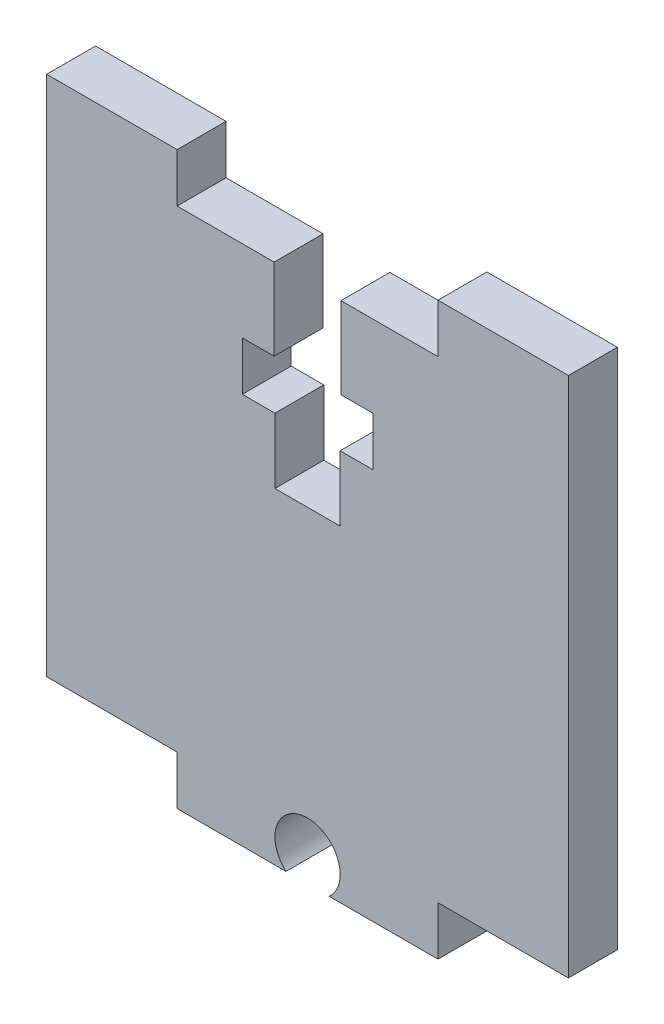
ISO-10303-21;
HEADER;
FILE_DESCRIPTION(('STEP AP214'),'2;1');
FILE_NAME('part.step','',(''),(''),'','','');
FILE_SCHEMA(('AUTOMOTIVE_DESIGN { 1 0 10303 214 1 1 1 1 }'));
ENDSEC;
DATA;
#1=APPLICATION_CONTEXT('core data for automotive mechanical design processes');
#2=APPLICATION_PROTOCOL_DEFINITION('international standard','automotive_design',2000,#1);
#3=PRODUCT_CONTEXT('',#1,'mechanical');
#4=PRODUCT('Part','Part','',(#3));
#5=PRODUCT_RELATED_PRODUCT_CATEGORY('part','',(#4));
#6=PRODUCT_DEFINITION_FORMATION('','',#4);
#7=PRODUCT_DEFINITION_CONTEXT('part definition',#1,'design');
#8=PRODUCT_DEFINITION('design','',#6,#7);
#9=PRODUCT_DEFINITION_SHAPE('','',#8);
#10=(LENGTH_UNIT() NAMED_UNIT(*) SI_UNIT(.MILLI.,.METRE.));
#11=(NAMED_UNIT(*) PLANE_ANGLE_UNIT() SI_UNIT($,.RADIAN.));
#12=(NAMED_UNIT(*) SI_UNIT($,.STERADIAN.) SOLID_ANGLE_UNIT());
#13=UNCERTAINTY_MEASURE_WITH_UNIT(LENGTH_MEASURE(1.E-05),#10,'distance_accuracy_value','');
#14=(GEOMETRIC_REPRESENTATION_CONTEXT(3) GLOBAL_UNCERTAINTY_ASSIGNED_CONTEXT((#13)) GLOBAL_UNIT_ASSIGNED_CONTEXT((#10,
#11,#12)) REPRESENTATION_CONTEXT('',''));
#15=CARTESIAN_POINT('',(0.,0.,0.));
#16=DIRECTION('',(0.,0.,1.));
#17=DIRECTION('',(1.,0.,0.));
#18=AXIS2_PLACEMENT_3D('',#15,#16,#17);
#19=CARTESIAN_POINT('',(0.,18.3553054771042,3.));
#20=DIRECTION('',(0.,0.,-1.));
#21=DIRECTION('',(-1.,0.,0.));
#22=AXIS2_PLACEMENT_3D('',#19,#20,#21);
#23=CYLINDRICAL_SURFACE('',#22,2.);
#24=CARTESIAN_POINT('',(0.,18.3553054771042,0.));
#25=DIRECTION('',(0.,0.,-1.));
#26=DIRECTION('',(1.,0.,0.));
#27=AXIS2_PLACEMENT_3D('',#24,#25,#26);
#28=CIRCLE('',#27,2.);
#29=CARTESIAN_POINT('',(-1.3228756555323,16.8553054771042,0.));
#30=VERTEX_POINT('',#29);
#31=CARTESIAN_POINT('',(1.3228756555323,16.8553054771042,0.));
#32=VERTEX_POINT('',#31);
#33=EDGE_CURVE('E237',#30,#32,#28,.T.);
#34=ORIENTED_EDGE('',*,*,#33,.T.);
#35=DIRECTION('',(0.,0.,-1.));
#36=VECTOR('',#35,1.);
#37=CARTESIAN_POINT('',(1.3228756555323,16.8553054771042,3.));
#38=LINE('',#37,#36);
#39=CARTESIAN_POINT('',(1.3228756555323,16.8553054771042,3.));
#40=VERTEX_POINT('',#39);
#41=EDGE_CURVE('E11',#40,#32,#38,.T.);
#42=ORIENTED_EDGE('',*,*,#41,.F.);
#43=CARTESIAN_POINT('',(0.,18.3553054771042,3.));
#44=DIRECTION('',(0.,0.,-1.));
#45=DIRECTION('',(1.,0.,0.));
#46=AXIS2_PLACEMENT_3D('',#43,#44,#45);
#47=CIRCLE('',#46,2.);
#48=CARTESIAN_POINT('',(-1.3228756555323,16.8553054771042,3.));
#49=VERTEX_POINT('',#48);
#50=EDGE_CURVE('E287',#49,#40,#47,.T.);
#51=ORIENTED_EDGE('',*,*,#50,.F.);
#52=DIRECTION('',(0.,0.,-1.));
#53=VECTOR('',#52,1.);
#54=CARTESIAN_POINT('',(-1.3228756555323,16.8553054771042,3.));
#55=LINE('',#54,#53);
#56=EDGE_CURVE('E233',#49,#30,#55,.T.);
#57=ORIENTED_EDGE('',*,*,#56,.T.);
#58=EDGE_LOOP('',(#34,#42,#51,#57));
#59=FACE_BOUND('',#58,.T.);
#60=ADVANCED_FACE('F33',(#59),#23,.F.);
#61=CARTESIAN_POINT('',(1.3228756555323,16.8553054771042,3.));
#62=DIRECTION('',(0.,1.,0.));
#63=DIRECTION('',(0.,0.,1.));
#64=AXIS2_PLACEMENT_3D('',#61,#62,#63);
#65=PLANE('',#64);
#66=DIRECTION('',(1.,0.,0.));
#67=VECTOR('',#66,1.);
#68=CARTESIAN_POINT('',(1.3228756555323,16.8553054771042,0.));
#69=LINE('',#68,#67);
#70=CARTESIAN_POINT('',(8.00000000000001,16.8553054771042,0.));
#71=VERTEX_POINT('',#70);
#72=EDGE_CURVE('E240',#32,#71,#69,.T.);
#73=ORIENTED_EDGE('',*,*,#72,.T.);
#74=DIRECTION('',(0.,0.,-1.));
#75=VECTOR('',#74,1.);
#76=CARTESIAN_POINT('',(8.00000000000001,16.8553054771042,3.));
#77=LINE('',#76,#75);
#78=CARTESIAN_POINT('',(8.00000000000001,16.8553054771042,3.));
#79=VERTEX_POINT('',#78);
#80=EDGE_CURVE('E41',#79,#71,#77,.T.);
#81=ORIENTED_EDGE('',*,*,#80,.F.);
#82=DIRECTION('',(1.,0.,0.));
#83=VECTOR('',#82,1.);
#84=CARTESIAN_POINT('',(1.3228756555323,16.8553054771042,3.));
#85=LINE('',#84,#83);
#86=EDGE_CURVE('E146',#40,#79,#85,.T.);
#87=ORIENTED_EDGE('',*,*,#86,.F.);
#88=ORIENTED_EDGE('',*,*,#41,.T.);
#89=EDGE_LOOP('',(#73,#81,#87,#88));
#90=FACE_BOUND('',#89,.T.);
#91=ADVANCED_FACE('F435',(#90),#65,.F.);
#92=CARTESIAN_POINT('',(8.00000000000001,16.8553054771042,3.));
#93=DIRECTION('',(-1.,0.,0.));
#94=DIRECTION('',(0.,0.,1.));
#95=AXIS2_PLACEMENT_3D('',#92,#93,#94);
#96=PLANE('',#95);
#97=DIRECTION('',(0.,1.,0.));
#98=VECTOR('',#97,1.);
#99=CARTESIAN_POINT('',(8.00000000000001,16.8553054771042,0.));
#100=LINE('',#99,#98);
#101=CARTESIAN_POINT('',(8.00000000000001,19.8553054771042,0.));
#102=VERTEX_POINT('',#101);
#103=EDGE_CURVE('E242',#71,#102,#100,.T.);
#104=ORIENTED_EDGE('',*,*,#103,.T.);
#105=DIRECTION('',(0.,0.,-1.));
#106=VECTOR('',#105,1.);
#107=CARTESIAN_POINT('',(8.00000000000001,19.8553054771042,3.));
#108=LINE('',#107,#106);
#109=CARTESIAN_POINT('',(8.00000000000001,19.8553054771042,3.));
#110=VERTEX_POINT('',#109);
#111=EDGE_CURVE('E348',#110,#102,#108,.T.);
#112=ORIENTED_EDGE('',*,*,#111,.F.);
#113=DIRECTION('',(0.,1.,0.));
#114=VECTOR('',#113,1.);
#115=CARTESIAN_POINT('',(8.00000000000001,16.8553054771042,3.));
#116=LINE('',#115,#114);
#117=EDGE_CURVE('E356',#79,#110,#116,.T.);
#118=ORIENTED_EDGE('',*,*,#117,.F.);
#119=ORIENTED_EDGE('',*,*,#80,.T.);
#120=EDGE_LOOP('',(#104,#112,#118,#119));
#121=FACE_BOUND('',#120,.T.);
#122=ADVANCED_FACE('F354',(#121),#96,.F.);
#123=CARTESIAN_POINT('',(16.,19.8553054771042,3.));
#124=DIRECTION('',(0.,1.,0.));
#125=DIRECTION('',(0.,0.,1.));
#126=AXIS2_PLACEMENT_3D('',#123,#124,#125);
#127=PLANE('',#126);
#128=DIRECTION('',(1.,0.,0.));
#129=VECTOR('',#128,1.);
#130=CARTESIAN_POINT('',(16.,19.8553054771042,0.));
#131=LINE('',#130,#129);
#132=CARTESIAN_POINT('',(16.,19.8553054771042,0.));
#133=VERTEX_POINT('',#132);
#134=EDGE_CURVE('E244',#102,#133,#131,.T.);
#135=ORIENTED_EDGE('',*,*,#134,.T.);
#136=DIRECTION('',(0.,0.,-1.));
#137=VECTOR('',#136,1.);
#138=CARTESIAN_POINT('',(16.,19.8553054771042,3.));
#139=LINE('',#138,#137);
#140=CARTESIAN_POINT('',(16.,19.8553054771042,3.));
#141=VERTEX_POINT('',#140);
#142=EDGE_CURVE('E345',#141,#133,#139,.T.);
#143=ORIENTED_EDGE('',*,*,#142,.F.);
#144=DIRECTION('',(1.,0.,0.));
#145=VECTOR('',#144,1.);
#146=CARTESIAN_POINT('',(16.,19.8553054771042,3.));
#147=LINE('',#146,#145);
#148=EDGE_CURVE('E374',#110,#141,#147,.T.);
#149=ORIENTED_EDGE('',*,*,#148,.F.);
#150=ORIENTED_EDGE('',*,*,#111,.T.);
#151=EDGE_LOOP('',(#135,#143,#149,#150));
#152=FACE_BOUND('',#151,.T.);
#153=ADVANCED_FACE('F365',(#152),#127,.F.);
#154=CARTESIAN_POINT('',(16.,51.8553054771042,3.));
#155=DIRECTION('',(-1.,0.,0.));
#156=DIRECTION('',(0.,0.,1.));
#157=AXIS2_PLACEMENT_3D('',#154,#155,#156);
#158=PLANE('',#157);
#159=DIRECTION('',(0.,1.,0.));
#160=VECTOR('',#159,1.);
#161=CARTESIAN_POINT('',(16.,51.8553054771042,0.));
#162=LINE('',#161,#160);
#163=CARTESIAN_POINT('',(16.,51.8553054771042,0.));
#164=VERTEX_POINT('',#163);
#165=EDGE_CURVE('E246',#133,#164,#162,.T.);
#166=ORIENTED_EDGE('',*,*,#165,.T.);
#167=DIRECTION('',(0.,0.,-1.));
#168=VECTOR('',#167,1.);
#169=CARTESIAN_POINT('',(16.,51.8553054771042,3.));
#170=LINE('',#169,#168);
#171=CARTESIAN_POINT('',(16.,51.8553054771042,3.));
#172=VERTEX_POINT('',#171);
#173=EDGE_CURVE('E342',#172,#164,#170,.T.);
#174=ORIENTED_EDGE('',*,*,#173,.F.);
#175=DIRECTION('',(0.,1.,0.));
#176=VECTOR('',#175,1.);
#177=CARTESIAN_POINT('',(16.,51.8553054771042,3.));
#178=LINE('',#177,#176);
#179=EDGE_CURVE('E371',#141,#172,#178,.T.);
#180=ORIENTED_EDGE('',*,*,#179,.F.);
#181=ORIENTED_EDGE('',*,*,#142,.T.);
#182=EDGE_LOOP('',(#166,#174,#180,#181));
#183=FACE_BOUND('',#182,.T.);
#184=ADVANCED_FACE('F369',(#183),#158,.F.);
#185=CARTESIAN_POINT('',(8.,51.8553054771042,3.));
#186=DIRECTION('',(0.,-1.,0.));
#187=DIRECTION('',(0.,0.,-1.));
#188=AXIS2_PLACEMENT_3D('',#185,#186,#187);
#189=PLANE('',#188);
#190=DIRECTION('',(-1.,0.,0.));
#191=VECTOR('',#190,1.);
#192=CARTESIAN_POINT('',(8.,51.8553054771042,0.));
#193=LINE('',#192,#191);
#194=CARTESIAN_POINT('',(8.,51.8553054771042,0.));
#195=VERTEX_POINT('',#194);
#196=EDGE_CURVE('E248',#164,#195,#193,.T.);
#197=ORIENTED_EDGE('',*,*,#196,.T.);
#198=DIRECTION('',(0.,0.,-1.));
#199=VECTOR('',#198,1.);
#200=CARTESIAN_POINT('',(8.,51.8553054771042,3.));
#201=LINE('',#200,#199);
#202=CARTESIAN_POINT('',(8.,51.8553054771042,3.));
#203=VERTEX_POINT('',#202);
#204=EDGE_CURVE('E339',#203,#195,#201,.T.);
#205=ORIENTED_EDGE('',*,*,#204,.F.);
#206=DIRECTION('',(-1.,0.,0.));
#207=VECTOR('',#206,1.);
#208=CARTESIAN_POINT('',(8.,51.8553054771042,3.));
#209=LINE('',#208,#207);
#210=EDGE_CURVE('E373',#172,#203,#209,.T.);
#211=ORIENTED_EDGE('',*,*,#210,.F.);
#212=ORIENTED_EDGE('',*,*,#173,.T.);
#213=EDGE_LOOP('',(#197,#205,#211,#212));
#214=FACE_BOUND('',#213,.T.);
#215=ADVANCED_FACE('F448',(#214),#189,.F.);
#216=CARTESIAN_POINT('',(8.,48.8553054771042,3.));
#217=DIRECTION('',(1.,0.,0.));
#218=DIRECTION('',(0.,0.,-1.));
#219=AXIS2_PLACEMENT_3D('',#216,#217,#218);
#220=PLANE('',#219);
#221=DIRECTION('',(0.,-1.,0.));
#222=VECTOR('',#221,1.);
#223=CARTESIAN_POINT('',(8.,48.8553054771042,0.));
#224=LINE('',#223,#222);
#225=CARTESIAN_POINT('',(8.,48.8553054771042,0.));
#226=VERTEX_POINT('',#225);
#227=EDGE_CURVE('E250',#195,#226,#224,.T.);
#228=ORIENTED_EDGE('',*,*,#227,.T.);
#229=DIRECTION('',(0.,0.,-1.));
#230=VECTOR('',#229,1.);
#231=CARTESIAN_POINT('',(8.,48.8553054771042,3.));
#232=LINE('',#231,#230);
#233=CARTESIAN_POINT('',(8.,48.8553054771042,3.));
#234=VERTEX_POINT('',#233);
#235=EDGE_CURVE('E336',#234,#226,#232,.T.);
#236=ORIENTED_EDGE('',*,*,#235,.F.);
#237=DIRECTION('',(0.,-1.,0.));
#238=VECTOR('',#237,1.);
#239=CARTESIAN_POINT('',(8.,48.8553054771042,3.));
#240=LINE('',#239,#238);
#241=EDGE_CURVE('E376',#203,#234,#240,.T.);
#242=ORIENTED_EDGE('',*,*,#241,.F.);
#243=ORIENTED_EDGE('',*,*,#204,.T.);
#244=EDGE_LOOP('',(#228,#236,#242,#243));
#245=FACE_BOUND('',#244,.T.);
#246=ADVANCED_FACE('F451',(#245),#220,.F.);
#247=CARTESIAN_POINT('',(2.04789002341845,48.8553054771042,3.));
#248=DIRECTION('',(0.,-1.,0.));
#249=DIRECTION('',(0.,0.,-1.));
#250=AXIS2_PLACEMENT_3D('',#247,#248,#249);
#251=PLANE('',#250);
#252=DIRECTION('',(-1.,0.,0.));
#253=VECTOR('',#252,1.);
#254=CARTESIAN_POINT('',(2.04789002341845,48.8553054771042,0.));
#255=LINE('',#254,#253);
#256=CARTESIAN_POINT('',(2.04789002341845,48.8553054771042,0.));
#257=VERTEX_POINT('',#256);
#258=EDGE_CURVE('E252',#226,#257,#255,.T.);
#259=ORIENTED_EDGE('',*,*,#258,.T.);
#260=DIRECTION('',(0.,0.,-1.));
#261=VECTOR('',#260,1.);
#262=CARTESIAN_POINT('',(2.04789002341845,48.8553054771042,3.));
#263=LINE('',#262,#261);
#264=CARTESIAN_POINT('',(2.04789002341845,48.8553054771042,3.));
#265=VERTEX_POINT('',#264);
#266=EDGE_CURVE('E333',#265,#257,#263,.T.);
#267=ORIENTED_EDGE('',*,*,#266,.F.);
#268=DIRECTION('',(-1.,0.,0.));
#269=VECTOR('',#268,1.);
#270=CARTESIAN_POINT('',(2.04789002341845,48.8553054771042,3.));
#271=LINE('',#270,#269);
#272=EDGE_CURVE('E382',#234,#265,#271,.T.);
#273=ORIENTED_EDGE('',*,*,#272,.F.);
#274=ORIENTED_EDGE('',*,*,#235,.T.);
#275=EDGE_LOOP('',(#259,#267,#273,#274));
#276=FACE_BOUND('',#275,.T.);
#277=ADVANCED_FACE('F455',(#276),#251,.F.);
#278=CARTESIAN_POINT('',(2.04789002341845,48.8553054771042,3.));
#279=DIRECTION('',(1.,0.,0.));
#280=DIRECTION('',(0.,1.,0.));
#281=AXIS2_PLACEMENT_3D('',#278,#279,#280);
#282=PLANE('',#281);
#283=DIRECTION('',(0.,-1.,0.));
#284=VECTOR('',#283,1.);
#285=CARTESIAN_POINT('',(2.04789002341845,48.8553054771042,0.));
#286=LINE('',#285,#284);
#287=CARTESIAN_POINT('',(2.04789002341845,43.8553054771042,0.));
#288=VERTEX_POINT('',#287);
#289=EDGE_CURVE('E254',#257,#288,#286,.T.);
#290=ORIENTED_EDGE('',*,*,#289,.T.);
#291=DIRECTION('',(0.,0.,-1.));
#292=VECTOR('',#291,1.);
#293=CARTESIAN_POINT('',(2.04789002341845,43.8553054771042,3.));
#294=LINE('',#293,#292);
#295=CARTESIAN_POINT('',(2.04789002341845,43.8553054771042,3.));
#296=VERTEX_POINT('',#295);
#297=EDGE_CURVE('E330',#296,#288,#294,.T.);
#298=ORIENTED_EDGE('',*,*,#297,.F.);
#299=DIRECTION('',(0.,-1.,0.));
#300=VECTOR('',#299,1.);
#301=CARTESIAN_POINT('',(2.04789002341845,48.8553054771042,3.));
#302=LINE('',#301,#300);
#303=EDGE_CURVE('E384',#265,#296,#302,.T.);
#304=ORIENTED_EDGE('',*,*,#303,.F.);
#305=ORIENTED_EDGE('',*,*,#266,.T.);
#306=EDGE_LOOP('',(#290,#298,#304,#305));
#307=FACE_BOUND('',#306,.T.);
#308=ADVANCED_FACE('F459',(#307),#282,.F.);
#309=CARTESIAN_POINT('',(2.04789002341845,43.8553054771042,3.));
#310=DIRECTION('',(0.,1.,0.));
#311=DIRECTION('',(-1.,0.,0.));
#312=AXIS2_PLACEMENT_3D('',#309,#310,#311);
#313=PLANE('',#312);
#314=DIRECTION('',(1.,0.,0.));
#315=VECTOR('',#314,1.);
#316=CARTESIAN_POINT('',(2.04789002341845,43.8553054771042,0.));
#317=LINE('',#316,#315);
#318=CARTESIAN_POINT('',(4.,43.8553054771042,0.));
#319=VERTEX_POINT('',#318);
#320=EDGE_CURVE('E256',#288,#319,#317,.T.);
#321=ORIENTED_EDGE('',*,*,#320,.T.);
#322=DIRECTION('',(0.,0.,-1.));
#323=VECTOR('',#322,1.);
#324=CARTESIAN_POINT('',(4.,43.8553054771042,3.));
#325=LINE('',#324,#323);
#326=CARTESIAN_POINT('',(4.,43.8553054771042,3.));
#327=VERTEX_POINT('',#326);
#328=EDGE_CURVE('E327',#327,#319,#325,.T.);
#329=ORIENTED_EDGE('',*,*,#328,.F.);
#330=DIRECTION('',(1.,0.,0.));
#331=VECTOR('',#330,1.);
#332=CARTESIAN_POINT('',(2.04789002341845,43.8553054771042,3.));
#333=LINE('',#332,#331);
#334=EDGE_CURVE('E386',#296,#327,#333,.T.);
#335=ORIENTED_EDGE('',*,*,#334,.F.);
#336=ORIENTED_EDGE('',*,*,#297,.T.);
#337=EDGE_LOOP('',(#321,#329,#335,#336));
#338=FACE_BOUND('',#337,.T.);
#339=ADVANCED_FACE('F463',(#338),#313,.F.);
#340=CARTESIAN_POINT('',(4.,43.8553054771042,3.));
#341=DIRECTION('',(1.,0.,0.));
#342=DIRECTION('',(0.,1.,0.));
#343=AXIS2_PLACEMENT_3D('',#340,#341,#342);
#344=PLANE('',#343);
#345=DIRECTION('',(0.,-1.,0.));
#346=VECTOR('',#345,1.);
#347=CARTESIAN_POINT('',(4.,43.8553054771042,0.));
#348=LINE('',#347,#346);
#349=CARTESIAN_POINT('',(4.,40.8553054771042,0.));
#350=VERTEX_POINT('',#349);
#351=EDGE_CURVE('E258',#319,#350,#348,.T.);
#352=ORIENTED_EDGE('',*,*,#351,.T.);
#353=DIRECTION('',(0.,0.,-1.));
#354=VECTOR('',#353,1.);
#355=CARTESIAN_POINT('',(4.,40.8553054771042,3.));
#356=LINE('',#355,#354);
#357=CARTESIAN_POINT('',(4.,40.8553054771042,3.));
#358=VERTEX_POINT('',#357);
#359=EDGE_CURVE('E324',#358,#350,#356,.T.);
#360=ORIENTED_EDGE('',*,*,#359,.F.);
#361=DIRECTION('',(0.,-1.,0.));
#362=VECTOR('',#361,1.);
#363=CARTESIAN_POINT('',(4.,43.8553054771042,3.));
#364=LINE('',#363,#362);
#365=EDGE_CURVE('E388',#327,#358,#364,.T.);
#366=ORIENTED_EDGE('',*,*,#365,.F.);
#367=ORIENTED_EDGE('',*,*,#328,.T.);
#368=EDGE_LOOP('',(#352,#360,#366,#367));
#369=FACE_BOUND('',#368,.T.);
#370=ADVANCED_FACE('F467',(#369),#344,.F.);
#371=CARTESIAN_POINT('',(4.,40.8553054771042,3.));
#372=DIRECTION('',(0.,-1.,0.));
#373=DIRECTION('',(0.,0.,-1.));
#374=AXIS2_PLACEMENT_3D('',#371,#372,#373);
#375=PLANE('',#374);
#376=DIRECTION('',(-1.,0.,0.));
#377=VECTOR('',#376,1.);
#378=CARTESIAN_POINT('',(4.,40.8553054771042,0.));
#379=LINE('',#378,#377);
#380=CARTESIAN_POINT('',(2.,40.8553054771042,0.));
#381=VERTEX_POINT('',#380);
#382=EDGE_CURVE('E260',#350,#381,#379,.T.);
#383=ORIENTED_EDGE('',*,*,#382,.T.);
#384=DIRECTION('',(0.,0.,-1.));
#385=VECTOR('',#384,1.);
#386=CARTESIAN_POINT('',(2.,40.8553054771042,3.));
#387=LINE('',#386,#385);
#388=CARTESIAN_POINT('',(2.,40.8553054771042,3.));
#389=VERTEX_POINT('',#388);
#390=EDGE_CURVE('E321',#389,#381,#387,.T.);
#391=ORIENTED_EDGE('',*,*,#390,.F.);
#392=DIRECTION('',(-1.,0.,0.));
#393=VECTOR('',#392,1.);
#394=CARTESIAN_POINT('',(4.,40.8553054771042,3.));
#395=LINE('',#394,#393);
#396=EDGE_CURVE('E390',#358,#389,#395,.T.);
#397=ORIENTED_EDGE('',*,*,#396,.F.);
#398=ORIENTED_EDGE('',*,*,#359,.T.);
#399=EDGE_LOOP('',(#383,#391,#397,#398));
#400=FACE_BOUND('',#399,.T.);
#401=ADVANCED_FACE('F471',(#400),#375,.F.);
#402=CARTESIAN_POINT('',(2.,40.8553054771042,3.));
#403=DIRECTION('',(1.,0.,0.));
#404=DIRECTION('',(0.,1.,0.));
#405=AXIS2_PLACEMENT_3D('',#402,#403,#404);
#406=PLANE('',#405);
#407=DIRECTION('',(0.,-1.,0.));
#408=VECTOR('',#407,1.);
#409=CARTESIAN_POINT('',(2.,40.8553054771042,0.));
#410=LINE('',#409,#408);
#411=CARTESIAN_POINT('',(2.,36.8553054771042,0.));
#412=VERTEX_POINT('',#411);
#413=EDGE_CURVE('E262',#381,#412,#410,.T.);
#414=ORIENTED_EDGE('',*,*,#413,.T.);
#415=DIRECTION('',(0.,0.,-1.));
#416=VECTOR('',#415,1.);
#417=CARTESIAN_POINT('',(2.,36.8553054771042,3.));
#418=LINE('',#417,#416);
#419=CARTESIAN_POINT('',(2.,36.8553054771042,3.));
#420=VERTEX_POINT('',#419);
#421=EDGE_CURVE('E318',#420,#412,#418,.T.);
#422=ORIENTED_EDGE('',*,*,#421,.F.);
#423=DIRECTION('',(0.,-1.,0.));
#424=VECTOR('',#423,1.);
#425=CARTESIAN_POINT('',(2.,40.8553054771042,3.));
#426=LINE('',#425,#424);
#427=EDGE_CURVE('E392',#389,#420,#426,.T.);
#428=ORIENTED_EDGE('',*,*,#427,.F.);
#429=ORIENTED_EDGE('',*,*,#390,.T.);
#430=EDGE_LOOP('',(#414,#422,#428,#429));
#431=FACE_BOUND('',#430,.T.);
#432=ADVANCED_FACE('F475',(#431),#406,.F.);
#433=CARTESIAN_POINT('',(2.,36.8553054771042,3.));
#434=DIRECTION('',(0.,-1.,0.));
#435=DIRECTION('',(0.,0.,-1.));
#436=AXIS2_PLACEMENT_3D('',#433,#434,#435);
#437=PLANE('',#436);
#438=DIRECTION('',(-1.,0.,0.));
#439=VECTOR('',#438,1.);
#440=CARTESIAN_POINT('',(2.,36.8553054771042,0.));
#441=LINE('',#440,#439);
#442=CARTESIAN_POINT('',(-2.,36.8553054771042,0.));
#443=VERTEX_POINT('',#442);
#444=EDGE_CURVE('E264',#412,#443,#441,.T.);
#445=ORIENTED_EDGE('',*,*,#444,.T.);
#446=DIRECTION('',(0.,0.,-1.));
#447=VECTOR('',#446,1.);
#448=CARTESIAN_POINT('',(-2.,36.8553054771042,3.));
#449=LINE('',#448,#447);
#450=CARTESIAN_POINT('',(-2.,36.8553054771042,3.));
#451=VERTEX_POINT('',#450);
#452=EDGE_CURVE('E315',#451,#443,#449,.T.);
#453=ORIENTED_EDGE('',*,*,#452,.F.);
#454=DIRECTION('',(-1.,0.,0.));
#455=VECTOR('',#454,1.);
#456=CARTESIAN_POINT('',(2.,36.8553054771042,3.));
#457=LINE('',#456,#455);
#458=EDGE_CURVE('E394',#420,#451,#457,.T.);
#459=ORIENTED_EDGE('',*,*,#458,.F.);
#460=ORIENTED_EDGE('',*,*,#421,.T.);
#461=EDGE_LOOP('',(#445,#453,#459,#460));
#462=FACE_BOUND('',#461,.T.);
#463=ADVANCED_FACE('F479',(#462),#437,.F.);
#464=CARTESIAN_POINT('',(-2.,40.8553054771042,3.));
#465=DIRECTION('',(-1.,0.,0.));
#466=DIRECTION('',(0.,-1.,0.));
#467=AXIS2_PLACEMENT_3D('',#464,#465,#466);
#468=PLANE('',#467);
#469=DIRECTION('',(0.,1.,0.));
#470=VECTOR('',#469,1.);
#471=CARTESIAN_POINT('',(-2.,40.8553054771042,0.));
#472=LINE('',#471,#470);
#473=CARTESIAN_POINT('',(-2.,40.8553054771042,0.));
#474=VERTEX_POINT('',#473);
#475=EDGE_CURVE('E266',#443,#474,#472,.T.);
#476=ORIENTED_EDGE('',*,*,#475,.T.);
#477=DIRECTION('',(0.,0.,-1.));
#478=VECTOR('',#477,1.);
#479=CARTESIAN_POINT('',(-2.,40.8553054771042,3.));
#480=LINE('',#479,#478);
#481=CARTESIAN_POINT('',(-2.,40.8553054771042,3.));
#482=VERTEX_POINT('',#481);
#483=EDGE_CURVE('E312',#482,#474,#480,.T.);
#484=ORIENTED_EDGE('',*,*,#483,.F.);
#485=DIRECTION('',(0.,1.,0.));
#486=VECTOR('',#485,1.);
#487=CARTESIAN_POINT('',(-2.,40.8553054771042,3.));
#488=LINE('',#487,#486);
#489=EDGE_CURVE('E396',#451,#482,#488,.T.);
#490=ORIENTED_EDGE('',*,*,#489,.F.);
#491=ORIENTED_EDGE('',*,*,#452,.T.);
#492=EDGE_LOOP('',(#476,#484,#490,#491));
#493=FACE_BOUND('',#492,.T.);
#494=ADVANCED_FACE('F483',(#493),#468,.F.);
#495=CARTESIAN_POINT('',(-4.00000000000001,40.8553054771042,3.));
#496=DIRECTION('',(0.,-1.,0.));
#497=DIRECTION('',(0.,0.,-1.));
#498=AXIS2_PLACEMENT_3D('',#495,#496,#497);
#499=PLANE('',#498);
#500=DIRECTION('',(-1.,0.,0.));
#501=VECTOR('',#500,1.);
#502=CARTESIAN_POINT('',(-4.00000000000001,40.8553054771042,0.));
#503=LINE('',#502,#501);
#504=CARTESIAN_POINT('',(-4.00000000000001,40.8553054771042,0.));
#505=VERTEX_POINT('',#504);
#506=EDGE_CURVE('E268',#474,#505,#503,.T.);
#507=ORIENTED_EDGE('',*,*,#506,.T.);
#508=DIRECTION('',(0.,0.,-1.));
#509=VECTOR('',#508,1.);
#510=CARTESIAN_POINT('',(-4.00000000000001,40.8553054771042,3.));
#511=LINE('',#510,#509);
#512=CARTESIAN_POINT('',(-4.00000000000001,40.8553054771042,3.));
#513=VERTEX_POINT('',#512);
#514=EDGE_CURVE('E309',#513,#505,#511,.T.);
#515=ORIENTED_EDGE('',*,*,#514,.F.);
#516=DIRECTION('',(-1.,0.,0.));
#517=VECTOR('',#516,1.);
#518=CARTESIAN_POINT('',(-4.00000000000001,40.8553054771042,3.));
#519=LINE('',#518,#517);
#520=EDGE_CURVE('E398',#482,#513,#519,.T.);
#521=ORIENTED_EDGE('',*,*,#520,.F.);
#522=ORIENTED_EDGE('',*,*,#483,.T.);
#523=EDGE_LOOP('',(#507,#515,#521,#522));
#524=FACE_BOUND('',#523,.T.);
#525=ADVANCED_FACE('F487',(#524),#499,.F.);
#526=CARTESIAN_POINT('',(-4.,43.8553054771042,3.));
#527=DIRECTION('',(-1.,0.,0.));
#528=DIRECTION('',(0.,-1.,0.));
#529=AXIS2_PLACEMENT_3D('',#526,#527,#528);
#530=PLANE('',#529);
#531=DIRECTION('',(0.,1.,0.));
#532=VECTOR('',#531,1.);
#533=CARTESIAN_POINT('',(-4.,43.8553054771042,0.));
#534=LINE('',#533,#532);
#535=CARTESIAN_POINT('',(-4.,43.8553054771042,0.));
#536=VERTEX_POINT('',#535);
#537=EDGE_CURVE('E270',#505,#536,#534,.T.);
#538=ORIENTED_EDGE('',*,*,#537,.T.);
#539=DIRECTION('',(0.,0.,-1.));
#540=VECTOR('',#539,1.);
#541=CARTESIAN_POINT('',(-4.,43.8553054771042,3.));
#542=LINE('',#541,#540);
#543=CARTESIAN_POINT('',(-4.,43.8553054771042,3.));
#544=VERTEX_POINT('',#543);
#545=EDGE_CURVE('E306',#544,#536,#542,.T.);
#546=ORIENTED_EDGE('',*,*,#545,.F.);
#547=DIRECTION('',(0.,1.,0.));
#548=VECTOR('',#547,1.);
#549=CARTESIAN_POINT('',(-4.,43.8553054771042,3.));
#550=LINE('',#549,#548);
#551=EDGE_CURVE('E400',#513,#544,#550,.T.);
#552=ORIENTED_EDGE('',*,*,#551,.F.);
#553=ORIENTED_EDGE('',*,*,#514,.T.);
#554=EDGE_LOOP('',(#538,#546,#552,#553));
#555=FACE_BOUND('',#554,.T.);
#556=ADVANCED_FACE('F491',(#555),#530,.F.);
#557=CARTESIAN_POINT('',(-2.04789002341846,43.8553054771042,3.));
#558=DIRECTION('',(0.,1.,0.));
#559=DIRECTION('',(-1.,0.,0.));
#560=AXIS2_PLACEMENT_3D('',#557,#558,#559);
#561=PLANE('',#560);
#562=DIRECTION('',(1.,0.,0.));
#563=VECTOR('',#562,1.);
#564=CARTESIAN_POINT('',(-2.04789002341846,43.8553054771042,0.));
#565=LINE('',#564,#563);
#566=CARTESIAN_POINT('',(-2.04789002341846,43.8553054771042,0.));
#567=VERTEX_POINT('',#566);
#568=EDGE_CURVE('E272',#536,#567,#565,.T.);
#569=ORIENTED_EDGE('',*,*,#568,.T.);
#570=DIRECTION('',(0.,0.,-1.));
#571=VECTOR('',#570,1.);
#572=CARTESIAN_POINT('',(-2.04789002341846,43.8553054771042,3.));
#573=LINE('',#572,#571);
#574=CARTESIAN_POINT('',(-2.04789002341846,43.8553054771042,3.));
#575=VERTEX_POINT('',#574);
#576=EDGE_CURVE('E303',#575,#567,#573,.T.);
#577=ORIENTED_EDGE('',*,*,#576,.F.);
#578=DIRECTION('',(1.,0.,0.));
#579=VECTOR('',#578,1.);
#580=CARTESIAN_POINT('',(-2.04789002341846,43.8553054771042,3.));
#581=LINE('',#580,#579);
#582=EDGE_CURVE('E402',#544,#575,#581,.T.);
#583=ORIENTED_EDGE('',*,*,#582,.F.);
#584=ORIENTED_EDGE('',*,*,#545,.T.);
#585=EDGE_LOOP('',(#569,#577,#583,#584));
#586=FACE_BOUND('',#585,.T.);
#587=ADVANCED_FACE('F495',(#586),#561,.F.);
#588=CARTESIAN_POINT('',(-2.04789002341846,48.8553054771042,3.));
#589=DIRECTION('',(-1.,0.,0.));
#590=DIRECTION('',(0.,-1.,0.));
#591=AXIS2_PLACEMENT_3D('',#588,#589,#590);
#592=PLANE('',#591);
#593=DIRECTION('',(0.,1.,0.));
#594=VECTOR('',#593,1.);
#595=CARTESIAN_POINT('',(-2.04789002341846,48.8553054771042,0.));
#596=LINE('',#595,#594);
#597=CARTESIAN_POINT('',(-2.04789002341846,48.8553054771042,0.));
#598=VERTEX_POINT('',#597);
#599=EDGE_CURVE('E274',#567,#598,#596,.T.);
#600=ORIENTED_EDGE('',*,*,#599,.T.);
#601=DIRECTION('',(0.,0.,-1.));
#602=VECTOR('',#601,1.);
#603=CARTESIAN_POINT('',(-2.04789002341846,48.8553054771042,3.));
#604=LINE('',#603,#602);
#605=CARTESIAN_POINT('',(-2.04789002341846,48.8553054771042,3.));
#606=VERTEX_POINT('',#605);
#607=EDGE_CURVE('E300',#606,#598,#604,.T.);
#608=ORIENTED_EDGE('',*,*,#607,.F.);
#609=DIRECTION('',(0.,1.,0.));
#610=VECTOR('',#609,1.);
#611=CARTESIAN_POINT('',(-2.04789002341846,48.8553054771042,3.));
#612=LINE('',#611,#610);
#613=EDGE_CURVE('E404',#575,#606,#612,.T.);
#614=ORIENTED_EDGE('',*,*,#613,.F.);
#615=ORIENTED_EDGE('',*,*,#576,.T.);
#616=EDGE_LOOP('',(#600,#608,#614,#615));
#617=FACE_BOUND('',#616,.T.);
#618=ADVANCED_FACE('F499',(#617),#592,.F.);
#619=CARTESIAN_POINT('',(-2.04789002341846,48.8553054771042,3.));
#620=DIRECTION('',(0.,-1.,0.));
#621=DIRECTION('',(0.,0.,-1.));
#622=AXIS2_PLACEMENT_3D('',#619,#620,#621);
#623=PLANE('',#622);
#624=DIRECTION('',(-1.,0.,0.));
#625=VECTOR('',#624,1.);
#626=CARTESIAN_POINT('',(-2.04789002341846,48.8553054771042,0.));
#627=LINE('',#626,#625);
#628=CARTESIAN_POINT('',(-8.00000000000001,48.8553054771042,0.));
#629=VERTEX_POINT('',#628);
#630=EDGE_CURVE('E276',#598,#629,#627,.T.);
#631=ORIENTED_EDGE('',*,*,#630,.T.);
#632=DIRECTION('',(0.,0.,-1.));
#633=VECTOR('',#632,1.);
#634=CARTESIAN_POINT('',(-8.00000000000001,48.8553054771042,3.));
#635=LINE('',#634,#633);
#636=CARTESIAN_POINT('',(-8.00000000000001,48.8553054771042,3.));
#637=VERTEX_POINT('',#636);
#638=EDGE_CURVE('E297',#637,#629,#635,.T.);
#639=ORIENTED_EDGE('',*,*,#638,.F.);
#640=DIRECTION('',(-1.,0.,0.));
#641=VECTOR('',#640,1.);
#642=CARTESIAN_POINT('',(-2.04789002341846,48.8553054771042,3.));
#643=LINE('',#642,#641);
#644=EDGE_CURVE('E406',#606,#637,#643,.T.);
#645=ORIENTED_EDGE('',*,*,#644,.F.);
#646=ORIENTED_EDGE('',*,*,#607,.T.);
#647=EDGE_LOOP('',(#631,#639,#645,#646));
#648=FACE_BOUND('',#647,.T.);
#649=ADVANCED_FACE('F503',(#648),#623,.F.);
#650=CARTESIAN_POINT('',(-8.00000000000001,48.8553054771042,3.));
#651=DIRECTION('',(-1.,0.,0.));
#652=DIRECTION('',(0.,0.,1.));
#653=AXIS2_PLACEMENT_3D('',#650,#651,#652);
#654=PLANE('',#653);
#655=DIRECTION('',(0.,1.,0.));
#656=VECTOR('',#655,1.);
#657=CARTESIAN_POINT('',(-8.00000000000001,48.8553054771042,0.));
#658=LINE('',#657,#656);
#659=CARTESIAN_POINT('',(-8.00000000000001,51.8553054771042,0.));
#660=VERTEX_POINT('',#659);
#661=EDGE_CURVE('E278',#629,#660,#658,.T.);
#662=ORIENTED_EDGE('',*,*,#661,.T.);
#663=DIRECTION('',(0.,0.,-1.));
#664=VECTOR('',#663,1.);
#665=CARTESIAN_POINT('',(-8.00000000000001,51.8553054771042,3.));
#666=LINE('',#665,#664);
#667=CARTESIAN_POINT('',(-8.00000000000001,51.8553054771042,3.));
#668=VERTEX_POINT('',#667);
#669=EDGE_CURVE('E294',#668,#660,#666,.T.);
#670=ORIENTED_EDGE('',*,*,#669,.F.);
#671=DIRECTION('',(0.,1.,0.));
#672=VECTOR('',#671,1.);
#673=CARTESIAN_POINT('',(-8.00000000000001,48.8553054771042,3.));
#674=LINE('',#673,#672);
#675=EDGE_CURVE('E408',#637,#668,#674,.T.);
#676=ORIENTED_EDGE('',*,*,#675,.F.);
#677=ORIENTED_EDGE('',*,*,#638,.T.);
#678=EDGE_LOOP('',(#662,#670,#676,#677));
#679=FACE_BOUND('',#678,.T.);
#680=ADVANCED_FACE('F507',(#679),#654,.F.);
#681=CARTESIAN_POINT('',(-8.00000000000001,51.8553054771042,3.));
#682=DIRECTION('',(0.,-1.,0.));
#683=DIRECTION('',(0.,0.,-1.));
#684=AXIS2_PLACEMENT_3D('',#681,#682,#683);
#685=PLANE('',#684);
#686=DIRECTION('',(-1.,0.,0.));
#687=VECTOR('',#686,1.);
#688=CARTESIAN_POINT('',(-8.00000000000001,51.8553054771042,0.));
#689=LINE('',#688,#687);
#690=CARTESIAN_POINT('',(-16.,51.8553054771042,0.));
#691=VERTEX_POINT('',#690);
#692=EDGE_CURVE('E280',#660,#691,#689,.T.);
#693=ORIENTED_EDGE('',*,*,#692,.T.);
#694=DIRECTION('',(0.,0.,-1.));
#695=VECTOR('',#694,1.);
#696=CARTESIAN_POINT('',(-16.,51.8553054771042,3.));
#697=LINE('',#696,#695);
#698=CARTESIAN_POINT('',(-16.,51.8553054771042,3.));
#699=VERTEX_POINT('',#698);
#700=EDGE_CURVE('E291',#699,#691,#697,.T.);
#701=ORIENTED_EDGE('',*,*,#700,.F.);
#702=DIRECTION('',(-1.,0.,0.));
#703=VECTOR('',#702,1.);
#704=CARTESIAN_POINT('',(-8.00000000000001,51.8553054771042,3.));
#705=LINE('',#704,#703);
#706=EDGE_CURVE('E410',#668,#699,#705,.T.);
#707=ORIENTED_EDGE('',*,*,#706,.F.);
#708=ORIENTED_EDGE('',*,*,#669,.T.);
#709=EDGE_LOOP('',(#693,#701,#707,#708));
#710=FACE_BOUND('',#709,.T.);
#711=ADVANCED_FACE('F416',(#710),#685,.F.);
#712=CARTESIAN_POINT('',(-16.,51.8553054771042,3.));
#713=DIRECTION('',(1.,0.,0.));
#714=DIRECTION('',(0.,0.,-1.));
#715=AXIS2_PLACEMENT_3D('',#712,#713,#714);
#716=PLANE('',#715);
#717=DIRECTION('',(0.,-1.,0.));
#718=VECTOR('',#717,1.);
#719=CARTESIAN_POINT('',(-16.,51.8553054771042,0.));
#720=LINE('',#719,#718);
#721=CARTESIAN_POINT('',(-16.,19.8553054771042,0.));
#722=VERTEX_POINT('',#721);
#723=EDGE_CURVE('E282',#691,#722,#720,.T.);
#724=ORIENTED_EDGE('',*,*,#723,.T.);
#725=DIRECTION('',(0.,0.,-1.));
#726=VECTOR('',#725,1.);
#727=CARTESIAN_POINT('',(-16.,19.8553054771042,3.));
#728=LINE('',#727,#726);
#729=CARTESIAN_POINT('',(-16.,19.8553054771042,3.));
#730=VERTEX_POINT('',#729);
#731=EDGE_CURVE('E228',#730,#722,#728,.T.);
#732=ORIENTED_EDGE('',*,*,#731,.F.);
#733=DIRECTION('',(0.,-1.,0.));
#734=VECTOR('',#733,1.);
#735=CARTESIAN_POINT('',(-16.,51.8553054771042,3.));
#736=LINE('',#735,#734);
#737=EDGE_CURVE('E219',#699,#730,#736,.T.);
#738=ORIENTED_EDGE('',*,*,#737,.F.);
#739=ORIENTED_EDGE('',*,*,#700,.T.);
#740=EDGE_LOOP('',(#724,#732,#738,#739));
#741=FACE_BOUND('',#740,.T.);
#742=ADVANCED_FACE('F420',(#741),#716,.F.);
#743=CARTESIAN_POINT('',(-16.,19.8553054771042,3.));
#744=DIRECTION('',(0.,1.,0.));
#745=DIRECTION('',(0.,0.,1.));
#746=AXIS2_PLACEMENT_3D('',#743,#744,#745);
#747=PLANE('',#746);
#748=DIRECTION('',(1.,0.,0.));
#749=VECTOR('',#748,1.);
#750=CARTESIAN_POINT('',(-16.,19.8553054771042,0.));
#751=LINE('',#750,#749);
#752=CARTESIAN_POINT('',(-8.00000000000001,19.8553054771042,0.));
#753=VERTEX_POINT('',#752);
#754=EDGE_CURVE('E227',#722,#753,#751,.T.);
#755=ORIENTED_EDGE('',*,*,#754,.T.);
#756=DIRECTION('',(0.,0.,-1.));
#757=VECTOR('',#756,1.);
#758=CARTESIAN_POINT('',(-8.00000000000001,19.8553054771042,3.));
#759=LINE('',#758,#757);
#760=CARTESIAN_POINT('',(-8.00000000000001,19.8553054771042,3.));
#761=VERTEX_POINT('',#760);
#762=EDGE_CURVE('E224',#761,#753,#759,.T.);
#763=ORIENTED_EDGE('',*,*,#762,.F.);
#764=DIRECTION('',(1.,0.,0.));
#765=VECTOR('',#764,1.);
#766=CARTESIAN_POINT('',(-16.,19.8553054771042,3.));
#767=LINE('',#766,#765);
#768=EDGE_CURVE('E213',#730,#761,#767,.T.);
#769=ORIENTED_EDGE('',*,*,#768,.F.);
#770=ORIENTED_EDGE('',*,*,#731,.T.);
#771=EDGE_LOOP('',(#755,#763,#769,#770));
#772=FACE_BOUND('',#771,.T.);
#773=ADVANCED_FACE('F225',(#772),#747,.F.);
#774=CARTESIAN_POINT('',(-8.00000000000001,16.8553054771042,3.));
#775=DIRECTION('',(1.,0.,0.));
#776=DIRECTION('',(0.,0.,-1.));
#777=AXIS2_PLACEMENT_3D('',#774,#775,#776);
#778=PLANE('',#777);
#779=DIRECTION('',(0.,-1.,0.));
#780=VECTOR('',#779,1.);
#781=CARTESIAN_POINT('',(-8.00000000000001,16.8553054771042,0.));
#782=LINE('',#781,#780);
#783=CARTESIAN_POINT('',(-8.00000000000001,16.8553054771042,0.));
#784=VERTEX_POINT('',#783);
#785=EDGE_CURVE('E132',#753,#784,#782,.T.);
#786=ORIENTED_EDGE('',*,*,#785,.T.);
#787=DIRECTION('',(0.,0.,-1.));
#788=VECTOR('',#787,1.);
#789=CARTESIAN_POINT('',(-8.00000000000001,16.8553054771042,3.));
#790=LINE('',#789,#788);
#791=CARTESIAN_POINT('',(-8.00000000000001,16.8553054771042,3.));
#792=VERTEX_POINT('',#791);
#793=EDGE_CURVE('E229',#792,#784,#790,.T.);
#794=ORIENTED_EDGE('',*,*,#793,.F.);
#795=DIRECTION('',(0.,-1.,0.));
#796=VECTOR('',#795,1.);
#797=CARTESIAN_POINT('',(-8.00000000000001,16.8553054771042,3.));
#798=LINE('',#797,#796);
#799=EDGE_CURVE('E217',#761,#792,#798,.T.);
#800=ORIENTED_EDGE('',*,*,#799,.F.);
#801=ORIENTED_EDGE('',*,*,#762,.T.);
#802=EDGE_LOOP('',(#786,#794,#800,#801));
#803=FACE_BOUND('',#802,.T.);
#804=ADVANCED_FACE('F231',(#803),#778,.F.);
#805=CARTESIAN_POINT('',(-1.3228756555323,16.8553054771042,3.));
#806=DIRECTION('',(0.,1.,0.));
#807=DIRECTION('',(0.,0.,1.));
#808=AXIS2_PLACEMENT_3D('',#805,#806,#807);
#809=PLANE('',#808);
#810=DIRECTION('',(1.,0.,0.));
#811=VECTOR('',#810,1.);
#812=CARTESIAN_POINT('',(-1.3228756555323,16.8553054771042,0.));
#813=LINE('',#812,#811);
#814=EDGE_CURVE('E138',#784,#30,#813,.T.);
#815=ORIENTED_EDGE('',*,*,#814,.T.);
#816=ORIENTED_EDGE('',*,*,#56,.F.);
#817=DIRECTION('',(1.,0.,0.));
#818=VECTOR('',#817,1.);
#819=CARTESIAN_POINT('',(-1.3228756555323,16.8553054771042,3.));
#820=LINE('',#819,#818);
#821=EDGE_CURVE('E49',#792,#49,#820,.T.);
#822=ORIENTED_EDGE('',*,*,#821,.F.);
#823=ORIENTED_EDGE('',*,*,#793,.T.);
#824=EDGE_LOOP('',(#815,#816,#822,#823));
#825=FACE_BOUND('',#824,.T.);
#826=ADVANCED_FACE('F424',(#825),#809,.F.);
#827=CARTESIAN_POINT('',(0.,18.3553054771042,3.));
#828=DIRECTION('',(0.,0.,1.));
#829=DIRECTION('',(1.,0.,0.));
#830=AXIS2_PLACEMENT_3D('',#827,#828,#829);
#831=PLANE('',#830);
#832=ORIENTED_EDGE('',*,*,#50,.T.);
#833=ORIENTED_EDGE('',*,*,#86,.T.);
#834=ORIENTED_EDGE('',*,*,#117,.T.);
#835=ORIENTED_EDGE('',*,*,#148,.T.);
#836=ORIENTED_EDGE('',*,*,#179,.T.);
#837=ORIENTED_EDGE('',*,*,#210,.T.);
#838=ORIENTED_EDGE('',*,*,#241,.T.);
#839=ORIENTED_EDGE('',*,*,#272,.T.);
#840=ORIENTED_EDGE('',*,*,#303,.T.);
#841=ORIENTED_EDGE('',*,*,#334,.T.);
#842=ORIENTED_EDGE('',*,*,#365,.T.);
#843=ORIENTED_EDGE('',*,*,#396,.T.);
#844=ORIENTED_EDGE('',*,*,#427,.T.);
#845=ORIENTED_EDGE('',*,*,#458,.T.);
#846=ORIENTED_EDGE('',*,*,#489,.T.);
#847=ORIENTED_EDGE('',*,*,#520,.T.);
#848=ORIENTED_EDGE('',*,*,#551,.T.);
#849=ORIENTED_EDGE('',*,*,#582,.T.);
#850=ORIENTED_EDGE('',*,*,#613,.T.);
#851=ORIENTED_EDGE('',*,*,#644,.T.);
#852=ORIENTED_EDGE('',*,*,#675,.T.);
#853=ORIENTED_EDGE('',*,*,#706,.T.);
#854=ORIENTED_EDGE('',*,*,#737,.T.);
#855=ORIENTED_EDGE('',*,*,#768,.T.);
#856=ORIENTED_EDGE('',*,*,#799,.T.);
#857=ORIENTED_EDGE('',*,*,#821,.T.);
#858=EDGE_LOOP('',(#832,#833,#834,#835,#836,#837,#838,#839,#840,#841,#842,#843,#844,#845,#846,
#847,#848,#849,#850,#851,#852,#853,#854,#855,#856,#857));
#859=FACE_BOUND('',#858,.T.);
#860=ADVANCED_FACE('F215',(#859),#831,.T.);
#861=CARTESIAN_POINT('',(0.,18.3553054771042,0.));
#862=DIRECTION('',(0.,0.,1.));
#863=DIRECTION('',(1.,0.,0.));
#864=AXIS2_PLACEMENT_3D('',#861,#862,#863);
#865=PLANE('',#864);
#866=ORIENTED_EDGE('',*,*,#33,.F.);
#867=ORIENTED_EDGE('',*,*,#814,.F.);
#868=ORIENTED_EDGE('',*,*,#785,.F.);
#869=ORIENTED_EDGE('',*,*,#754,.F.);
#870=ORIENTED_EDGE('',*,*,#723,.F.);
#871=ORIENTED_EDGE('',*,*,#692,.F.);
#872=ORIENTED_EDGE('',*,*,#661,.F.);
#873=ORIENTED_EDGE('',*,*,#630,.F.);
#874=ORIENTED_EDGE('',*,*,#599,.F.);
#875=ORIENTED_EDGE('',*,*,#568,.F.);
#876=ORIENTED_EDGE('',*,*,#537,.F.);
#877=ORIENTED_EDGE('',*,*,#506,.F.);
#878=ORIENTED_EDGE('',*,*,#475,.F.);
#879=ORIENTED_EDGE('',*,*,#444,.F.);
#880=ORIENTED_EDGE('',*,*,#413,.F.);
#881=ORIENTED_EDGE('',*,*,#382,.F.);
#882=ORIENTED_EDGE('',*,*,#351,.F.);
#883=ORIENTED_EDGE('',*,*,#320,.F.);
#884=ORIENTED_EDGE('',*,*,#289,.F.);
#885=ORIENTED_EDGE('',*,*,#258,.F.);
#886=ORIENTED_EDGE('',*,*,#227,.F.);
#887=ORIENTED_EDGE('',*,*,#196,.F.);
#888=ORIENTED_EDGE('',*,*,#165,.F.);
#889=ORIENTED_EDGE('',*,*,#134,.F.);
#890=ORIENTED_EDGE('',*,*,#103,.F.);
#891=ORIENTED_EDGE('',*,*,#72,.F.);
#892=EDGE_LOOP('',(#866,#867,#868,#869,#870,#871,#872,#873,#874,#875,#876,#877,#878,#879,#880,
#881,#882,#883,#884,#885,#886,#887,#888,#889,#890,#891));
#893=FACE_BOUND('',#892,.T.);
#894=ADVANCED_FACE('F360',(#893),#865,.F.);
#895=CLOSED_SHELL('',(#60,#91,#122,#153,#184,#215,#246,#277,#308,#339,#370,#401,#432,#463,#494,
#525,#556,#587,#618,#649,#680,#711,#742,#773,#804,#826,#860,#894));
#896=MANIFOLD_SOLID_BREP('B2',#895);
#897=ADVANCED_BREP_SHAPE_REPRESENTATION('',(#18,#896),#14);
#898=SHAPE_DEFINITION_REPRESENTATION(#9,#897);
ENDSEC;
END-ISO-10303-21;
